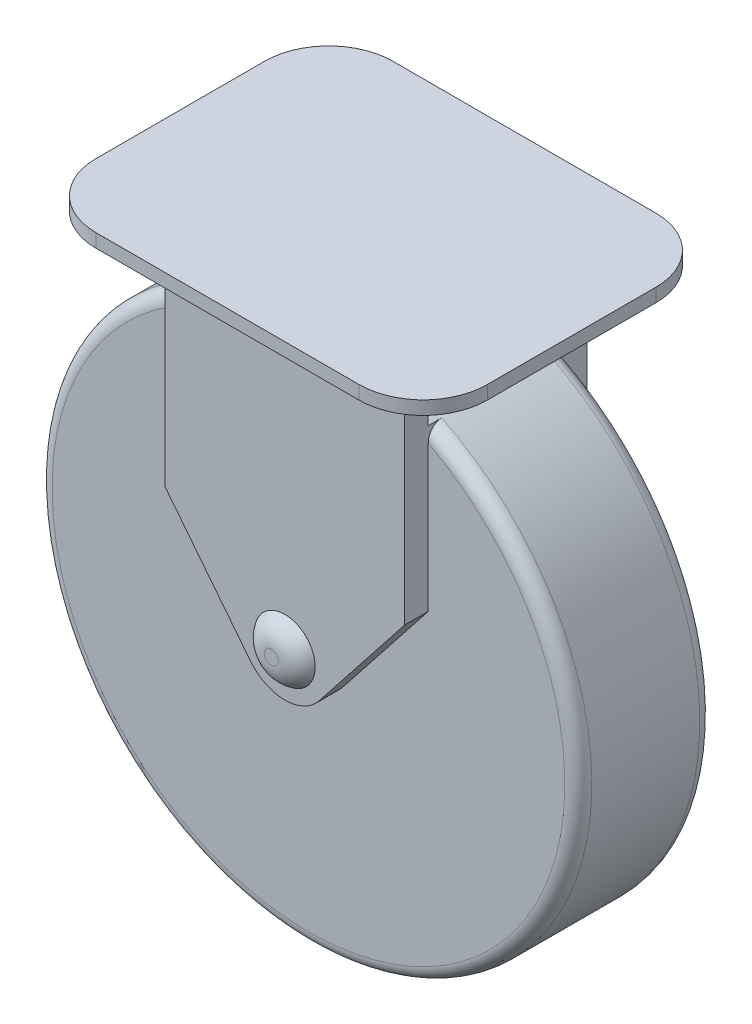
ISO-10303-21;
HEADER;
FILE_DESCRIPTION(('STEP AP214'),'2;1');
FILE_NAME('part.step','',(''),(''),'','','');
FILE_SCHEMA(('AUTOMOTIVE_DESIGN { 1 0 10303 214 1 1 1 1 }'));
ENDSEC;
DATA;
#1=APPLICATION_CONTEXT('core data for automotive mechanical design processes');
#2=APPLICATION_PROTOCOL_DEFINITION('international standard','automotive_design',2000,#1);
#3=PRODUCT_CONTEXT('',#1,'mechanical');
#4=PRODUCT('Part','Part','',(#3));
#5=PRODUCT_RELATED_PRODUCT_CATEGORY('part','',(#4));
#6=PRODUCT_DEFINITION_FORMATION('','',#4);
#7=PRODUCT_DEFINITION_CONTEXT('part definition',#1,'design');
#8=PRODUCT_DEFINITION('design','',#6,#7);
#9=PRODUCT_DEFINITION_SHAPE('','',#8);
#10=(LENGTH_UNIT() NAMED_UNIT(*) SI_UNIT(.MILLI.,.METRE.));
#11=(NAMED_UNIT(*) PLANE_ANGLE_UNIT() SI_UNIT($,.RADIAN.));
#12=(NAMED_UNIT(*) SI_UNIT($,.STERADIAN.) SOLID_ANGLE_UNIT());
#13=UNCERTAINTY_MEASURE_WITH_UNIT(LENGTH_MEASURE(1.E-05),#10,'distance_accuracy_value','');
#14=(GEOMETRIC_REPRESENTATION_CONTEXT(3) GLOBAL_UNCERTAINTY_ASSIGNED_CONTEXT((#13)) GLOBAL_UNIT_ASSIGNED_CONTEXT((#10,
#11,#12)) REPRESENTATION_CONTEXT('',''));
#15=CARTESIAN_POINT('',(0.,0.,0.));
#16=DIRECTION('',(0.,0.,1.));
#17=DIRECTION('',(1.,0.,0.));
#18=AXIS2_PLACEMENT_3D('',#15,#16,#17);
#19=CARTESIAN_POINT('',(0.,0.,21.43125));
#20=DIRECTION('',(0.,0.,-1.));
#21=DIRECTION('',(-1.,0.,0.));
#22=AXIS2_PLACEMENT_3D('',#19,#20,#21);
#23=CYLINDRICAL_SURFACE('',#22,10.31875);
#24=DIRECTION('',(0.,0.,-1.));
#25=VECTOR('',#24,1.);
#26=CARTESIAN_POINT('',(8.10028110584669,-6.39234288573157,21.43125));
#27=LINE('',#26,#25);
#28=CARTESIAN_POINT('',(8.10028110584669,-6.39234288573157,-15.875));
#29=VERTEX_POINT('',#28);
#30=CARTESIAN_POINT('',(8.10028110584669,-6.39234288573157,-21.43125));
#31=VERTEX_POINT('',#30);
#32=EDGE_CURVE('E385',#29,#31,#27,.T.);
#33=ORIENTED_EDGE('',*,*,#32,.F.);
#34=CARTESIAN_POINT('',(0.,0.,-15.875));
#35=DIRECTION('',(0.,0.,1.));
#36=DIRECTION('',(1.,0.,0.));
#37=AXIS2_PLACEMENT_3D('',#34,#35,#36);
#38=CIRCLE('',#37,10.31875);
#39=CARTESIAN_POINT('',(-8.1002811058467,-6.39234288573157,-15.875));
#40=VERTEX_POINT('',#39);
#41=EDGE_CURVE('E414',#29,#40,#38,.F.);
#42=ORIENTED_EDGE('',*,*,#41,.T.);
#43=DIRECTION('',(0.,0.,-1.));
#44=VECTOR('',#43,1.);
#45=CARTESIAN_POINT('',(-8.1002811058467,-6.39234288573157,21.43125));
#46=LINE('',#45,#44);
#47=CARTESIAN_POINT('',(-8.1002811058467,-6.39234288573157,-21.43125));
#48=VERTEX_POINT('',#47);
#49=EDGE_CURVE('E342',#40,#48,#46,.T.);
#50=ORIENTED_EDGE('',*,*,#49,.T.);
#51=CARTESIAN_POINT('',(0.,0.,-21.43125));
#52=DIRECTION('',(0.,0.,1.));
#53=DIRECTION('',(1.,0.,0.));
#54=AXIS2_PLACEMENT_3D('',#51,#52,#53);
#55=CIRCLE('',#54,10.31875);
#56=EDGE_CURVE('E317',#48,#31,#55,.T.);
#57=ORIENTED_EDGE('',*,*,#56,.T.);
#58=EDGE_LOOP('',(#33,#42,#50,#57));
#59=FACE_BOUND('',#58,.T.);
#60=ADVANCED_FACE('F51',(#59),#23,.T.);
#61=CARTESIAN_POINT('',(8.10028110584669,-6.39234288573157,21.43125));
#62=DIRECTION('',(0.785006042965155,-0.619488105219292,0.));
#63=DIRECTION('',(0.619488105219292,0.785006042965155,0.));
#64=AXIS2_PLACEMENT_3D('',#61,#62,#63);
#65=PLANE('',#64);
#66=DIRECTION('',(0.619488105219292,0.785006042965155,0.));
#67=VECTOR('',#66,1.);
#68=CARTESIAN_POINT('',(8.10028110584669,-6.39234288573157,-15.875));
#69=LINE('',#68,#67);
#70=CARTESIAN_POINT('',(28.178125,19.05,-15.875));
#71=VERTEX_POINT('',#70);
#72=EDGE_CURVE('E418',#29,#71,#69,.T.);
#73=ORIENTED_EDGE('',*,*,#72,.F.);
#74=ORIENTED_EDGE('',*,*,#32,.T.);
#75=DIRECTION('',(-0.619488105219292,-0.785006042965155,0.));
#76=VECTOR('',#75,1.);
#77=CARTESIAN_POINT('',(8.10028110584669,-6.39234288573157,-21.43125));
#78=LINE('',#77,#76);
#79=CARTESIAN_POINT('',(28.178125,19.05,-21.43125));
#80=VERTEX_POINT('',#79);
#81=EDGE_CURVE('E346',#80,#31,#78,.T.);
#82=ORIENTED_EDGE('',*,*,#81,.F.);
#83=DIRECTION('',(0.,0.,-1.));
#84=VECTOR('',#83,1.);
#85=CARTESIAN_POINT('',(28.178125,19.05,21.43125));
#86=LINE('',#85,#84);
#87=EDGE_CURVE('E380',#71,#80,#86,.T.);
#88=ORIENTED_EDGE('',*,*,#87,.F.);
#89=EDGE_LOOP('',(#73,#74,#82,#88));
#90=FACE_BOUND('',#89,.T.);
#91=ADVANCED_FACE('F522',(#90),#65,.T.);
#92=CARTESIAN_POINT('',(-8.1002811058467,-6.39234288573157,21.43125));
#93=DIRECTION('',(-0.785006042965155,-0.619488105219292,0.));
#94=DIRECTION('',(0.619488105219292,-0.785006042965155,0.));
#95=AXIS2_PLACEMENT_3D('',#92,#93,#94);
#96=PLANE('',#95);
#97=DIRECTION('',(0.619488105219292,-0.785006042965155,0.));
#98=VECTOR('',#97,1.);
#99=CARTESIAN_POINT('',(-8.1002811058467,-6.39234288573157,-15.875));
#100=LINE('',#99,#98);
#101=CARTESIAN_POINT('',(-28.178125,19.05,-15.875));
#102=VERTEX_POINT('',#101);
#103=EDGE_CURVE('E407',#102,#40,#100,.T.);
#104=ORIENTED_EDGE('',*,*,#103,.F.);
#105=DIRECTION('',(0.,0.,-1.));
#106=VECTOR('',#105,1.);
#107=CARTESIAN_POINT('',(-28.178125,19.05,21.43125));
#108=LINE('',#107,#106);
#109=CARTESIAN_POINT('',(-28.178125,19.05,-21.43125));
#110=VERTEX_POINT('',#109);
#111=EDGE_CURVE('E368',#102,#110,#108,.T.);
#112=ORIENTED_EDGE('',*,*,#111,.T.);
#113=DIRECTION('',(-0.619488105219292,0.785006042965155,0.));
#114=VECTOR('',#113,1.);
#115=CARTESIAN_POINT('',(-8.1002811058467,-6.39234288573157,-21.43125));
#116=LINE('',#115,#114);
#117=EDGE_CURVE('E322',#48,#110,#116,.T.);
#118=ORIENTED_EDGE('',*,*,#117,.F.);
#119=ORIENTED_EDGE('',*,*,#49,.F.);
#120=EDGE_LOOP('',(#104,#112,#118,#119));
#121=FACE_BOUND('',#120,.T.);
#122=ADVANCED_FACE('F528',(#121),#96,.T.);
#123=CARTESIAN_POINT('',(0.,0.,15.875));
#124=DIRECTION('',(0.,0.,1.));
#125=DIRECTION('',(1.,0.,0.));
#126=AXIS2_PLACEMENT_3D('',#123,#124,#125);
#127=CIRCLE('',#126,10.31875);
#128=CARTESIAN_POINT('',(8.10028110584669,-6.39234288573157,15.875));
#129=VERTEX_POINT('',#128);
#130=CARTESIAN_POINT('',(-8.1002811058467,-6.39234288573157,15.875));
#131=VERTEX_POINT('',#130);
#132=EDGE_CURVE('E403',#129,#131,#127,.F.);
#133=ORIENTED_EDGE('',*,*,#132,.F.);
#134=CARTESIAN_POINT('',(8.10028110584669,-6.39234288573157,21.43125));
#135=VERTEX_POINT('',#134);
#136=EDGE_CURVE('E386',#135,#129,#27,.T.);
#137=ORIENTED_EDGE('',*,*,#136,.F.);
#138=CARTESIAN_POINT('',(0.,0.,21.43125));
#139=DIRECTION('',(0.,0.,1.));
#140=DIRECTION('',(1.,0.,0.));
#141=AXIS2_PLACEMENT_3D('',#138,#139,#140);
#142=CIRCLE('',#141,10.31875);
#143=CARTESIAN_POINT('',(-8.1002811058467,-6.39234288573157,21.43125));
#144=VERTEX_POINT('',#143);
#145=EDGE_CURVE('E318',#144,#135,#142,.T.);
#146=ORIENTED_EDGE('',*,*,#145,.F.);
#147=EDGE_CURVE('E364',#144,#131,#46,.T.);
#148=ORIENTED_EDGE('',*,*,#147,.T.);
#149=EDGE_LOOP('',(#133,#137,#146,#148));
#150=FACE_BOUND('',#149,.T.);
#151=ADVANCED_FACE('F524',(#150),#23,.T.);
#152=ORIENTED_EDGE('',*,*,#136,.T.);
#153=DIRECTION('',(0.619488105219292,0.785006042965155,0.));
#154=VECTOR('',#153,1.);
#155=CARTESIAN_POINT('',(8.10028110584669,-6.39234288573157,15.875));
#156=LINE('',#155,#154);
#157=CARTESIAN_POINT('',(28.178125,19.05,15.875));
#158=VERTEX_POINT('',#157);
#159=EDGE_CURVE('E400',#129,#158,#156,.T.);
#160=ORIENTED_EDGE('',*,*,#159,.T.);
#161=CARTESIAN_POINT('',(28.178125,19.05,21.43125));
#162=VERTEX_POINT('',#161);
#163=EDGE_CURVE('E381',#162,#158,#86,.T.);
#164=ORIENTED_EDGE('',*,*,#163,.F.);
#165=DIRECTION('',(-0.619488105219292,-0.785006042965155,0.));
#166=VECTOR('',#165,1.);
#167=CARTESIAN_POINT('',(8.10028110584669,-6.39234288573157,21.43125));
#168=LINE('',#167,#166);
#169=EDGE_CURVE('E321',#162,#135,#168,.T.);
#170=ORIENTED_EDGE('',*,*,#169,.T.);
#171=EDGE_LOOP('',(#152,#160,#164,#170));
#172=FACE_BOUND('',#171,.T.);
#173=ADVANCED_FACE('F481',(#172),#65,.T.);
#174=CARTESIAN_POINT('',(28.178125,0.,21.43125));
#175=DIRECTION('',(1.,0.,0.));
#176=DIRECTION('',(0.,0.,-1.));
#177=AXIS2_PLACEMENT_3D('',#174,#175,#176);
#178=PLANE('',#177);
#179=DIRECTION('',(0.,1.,0.));
#180=VECTOR('',#179,1.);
#181=CARTESIAN_POINT('',(28.178125,0.,-15.875));
#182=LINE('',#181,#180);
#183=CARTESIAN_POINT('',(28.178125,56.9055645036966,-15.875));
#184=VERTEX_POINT('',#183);
#185=CARTESIAN_POINT('',(28.178125,66.675,-15.875));
#186=VERTEX_POINT('',#185);
#187=EDGE_CURVE('E274',#184,#186,#182,.T.);
#188=ORIENTED_EDGE('',*,*,#187,.F.);
#189=DIRECTION('',(0.,0.,-1.));
#190=VECTOR('',#189,1.);
#191=CARTESIAN_POINT('',(28.178125,56.9055645036966,-12.7));
#192=LINE('',#191,#190);
#193=CARTESIAN_POINT('',(28.178125,56.9055645036966,-12.7));
#194=VERTEX_POINT('',#193);
#195=EDGE_CURVE('E447',#194,#184,#192,.T.);
#196=ORIENTED_EDGE('',*,*,#195,.F.);
#197=CARTESIAN_POINT('',(28.178125,56.9055645036966,-12.7));
#198=CARTESIAN_POINT('',(28.178125,56.9055784410819,-12.7825452910411));
#199=CARTESIAN_POINT('',(28.178125,56.9019726960796,-12.8650837659532));
#200=CARTESIAN_POINT('',(28.178125,56.8876287220627,-13.0295183018202));
#201=CARTESIAN_POINT('',(28.178125,56.8768922987349,-13.1114145201016));
#202=CARTESIAN_POINT('',(28.178125,56.8484423853257,-13.2737007313163));
#203=CARTESIAN_POINT('',(28.178125,56.8307528347604,-13.3540949112545));
#204=CARTESIAN_POINT('',(28.178125,56.7886146894372,-13.5130706926774));
#205=CARTESIAN_POINT('',(28.178125,56.7641659095749,-13.5916522444586));
#206=CARTESIAN_POINT('',(28.178125,56.6810754442341,-13.8237798323662));
#207=CARTESIAN_POINT('',(28.178125,56.6126481364356,-13.9739412327145));
#208=CARTESIAN_POINT('',(28.178125,56.4525116211937,-14.2612199352461));
#209=CARTESIAN_POINT('',(28.178125,56.3607885184095,-14.3983293849365));
#210=CARTESIAN_POINT('',(28.178125,56.1532674083132,-14.6619170637052));
#211=CARTESIAN_POINT('',(28.178125,56.0366552297094,-14.7877533337012));
#212=CARTESIAN_POINT('',(28.178125,55.7856826392004,-15.0201711161666));
#213=CARTESIAN_POINT('',(28.178125,55.6513187315286,-15.1267488263229));
#214=CARTESIAN_POINT('',(28.178125,55.3546962287607,-15.3287988512625));
#215=CARTESIAN_POINT('',(28.178125,55.1909939256116,-15.4221495715723));
#216=CARTESIAN_POINT('',(28.178125,54.8512948745381,-15.5831209708427));
#217=CARTESIAN_POINT('',(28.178125,54.6752864659418,-15.6507168437418));
#218=CARTESIAN_POINT('',(28.178125,54.3081148771441,-15.7618882266433));
#219=CARTESIAN_POINT('',(28.178125,54.1166267914801,-15.8043852723537));
#220=CARTESIAN_POINT('',(28.178125,53.7298750876661,-15.8609320963934));
#221=CARTESIAN_POINT('',(28.178125,53.5346198514007,-15.8750390029093));
#222=CARTESIAN_POINT('',(28.178125,53.3394684683338,-15.875));
#223=B_SPLINE_CURVE_WITH_KNOTS('',3,(#197,#198,#199,#200,#201,#202,#203,#204,#205,#206,#207,
#208,#209,#210,#211,#212,#213,#214,#215,#216,#217,#218,#219,#220,#221,#222),.UNSPECIFIED.,.F.,
.F.,(4,2,2,2,2,2,2,2,2,2,2,2,4),(0.,0.247545607339586,0.49502855311398,0.741666779109121,
0.988311760066779,1.48090239250049,1.97378753542249,2.48632722746523,2.99896800246119,
3.56200273153854,4.12557839096832,4.71187880713827,5.29699825323377),.UNSPECIFIED.);
#224=CARTESIAN_POINT('',(28.178125,53.3394684683338,-15.875));
#225=VERTEX_POINT('',#224);
#226=EDGE_CURVE('E457',#194,#225,#223,.T.);
#227=ORIENTED_EDGE('',*,*,#226,.T.);
#228=DIRECTION('',(0.,1.,0.));
#229=VECTOR('',#228,1.);
#230=CARTESIAN_POINT('',(28.178125,0.,-15.875));
#231=LINE('',#230,#229);
#232=EDGE_CURVE('E286',#71,#225,#231,.T.);
#233=ORIENTED_EDGE('',*,*,#232,.F.);
#234=ORIENTED_EDGE('',*,*,#87,.T.);
#235=DIRECTION('',(0.,-1.,0.));
#236=VECTOR('',#235,1.);
#237=CARTESIAN_POINT('',(28.178125,0.,-21.43125));
#238=LINE('',#237,#236);
#239=CARTESIAN_POINT('',(28.178125,73.025,-21.43125));
#240=VERTEX_POINT('',#239);
#241=EDGE_CURVE('E350',#240,#80,#238,.T.);
#242=ORIENTED_EDGE('',*,*,#241,.F.);
#243=DIRECTION('',(0.,0.,-1.));
#244=VECTOR('',#243,1.);
#245=CARTESIAN_POINT('',(28.178125,73.025,21.43125));
#246=LINE('',#245,#244);
#247=CARTESIAN_POINT('',(28.178125,73.025,21.43125));
#248=VERTEX_POINT('',#247);
#249=EDGE_CURVE('E376',#248,#240,#246,.T.);
#250=ORIENTED_EDGE('',*,*,#249,.F.);
#251=DIRECTION('',(0.,-1.,0.));
#252=VECTOR('',#251,1.);
#253=CARTESIAN_POINT('',(28.178125,0.,21.43125));
#254=LINE('',#253,#252);
#255=EDGE_CURVE('E326',#248,#162,#254,.T.);
#256=ORIENTED_EDGE('',*,*,#255,.T.);
#257=ORIENTED_EDGE('',*,*,#163,.T.);
#258=DIRECTION('',(0.,1.,0.));
#259=VECTOR('',#258,1.);
#260=CARTESIAN_POINT('',(28.178125,0.,15.875));
#261=LINE('',#260,#259);
#262=CARTESIAN_POINT('',(28.178125,53.3394684683338,15.875));
#263=VERTEX_POINT('',#262);
#264=EDGE_CURVE('E396',#158,#263,#261,.T.);
#265=ORIENTED_EDGE('',*,*,#264,.T.);
#266=CARTESIAN_POINT('',(28.178125,53.3394684683338,15.875));
#267=CARTESIAN_POINT('',(28.178125,53.4499569892648,15.8749946230494));
#268=CARTESIAN_POINT('',(28.178125,53.5604027488315,15.8704896075508));
#269=CARTESIAN_POINT('',(28.178125,53.7805815345682,15.8524341122105));
#270=CARTESIAN_POINT('',(28.178125,53.8903143571871,15.8388811545989));
#271=CARTESIAN_POINT('',(28.178125,54.2180410124744,15.7844801601789));
#272=CARTESIAN_POINT('',(28.178125,54.4339168235813,15.7298893612635));
#273=CARTESIAN_POINT('',(28.178125,54.8535930769766,15.584047526342));
#274=CARTESIAN_POINT('',(28.178125,55.0573666307146,15.4927181231356));
#275=CARTESIAN_POINT('',(28.178125,55.3477296266557,15.3292131773186));
#276=CARTESIAN_POINT('',(28.178125,55.4419591448965,15.2703002156053));
#277=CARTESIAN_POINT('',(28.178125,55.6244213856614,15.1438551909129));
#278=CARTESIAN_POINT('',(28.178125,55.7126574375875,15.0763279742064));
#279=CARTESIAN_POINT('',(28.178125,55.8756781738629,14.9384414522539));
#280=CARTESIAN_POINT('',(28.178125,55.9509755103084,14.8686872920248));
#281=CARTESIAN_POINT('',(28.178125,56.0947300434389,14.7225121032731));
#282=CARTESIAN_POINT('',(28.178125,56.1631909789899,14.646094762196));
#283=CARTESIAN_POINT('',(28.178125,56.2924943001695,14.4870318768936));
#284=CARTESIAN_POINT('',(28.178125,56.3533351972729,14.4043851208275));
#285=CARTESIAN_POINT('',(28.178125,56.4665636800856,14.2334938988475));
#286=CARTESIAN_POINT('',(28.178125,56.5189526961119,14.1452503836054));
#287=CARTESIAN_POINT('',(28.178125,56.6089965529094,13.9743965141672));
#288=CARTESIAN_POINT('',(28.178125,56.6476544607948,13.8923135759775));
#289=CARTESIAN_POINT('',(28.178125,56.7172955631954,13.7249586348485));
#290=CARTESIAN_POINT('',(28.178125,56.7482798924925,13.6396871055927));
#291=CARTESIAN_POINT('',(28.178125,56.8021243363856,13.466800699863));
#292=CARTESIAN_POINT('',(28.178125,56.825000305078,13.3791907605498));
#293=CARTESIAN_POINT('',(28.178125,56.86239415031,13.2022461774297));
#294=CARTESIAN_POINT('',(28.178125,56.8769171780315,13.1129126317663));
#295=CARTESIAN_POINT('',(28.178125,56.8932965824253,12.969447977044));
#296=CARTESIAN_POINT('',(28.178125,56.8978983522866,12.9156162514886));
#297=CARTESIAN_POINT('',(28.178125,56.904030765547,12.8078589113691));
#298=CARTESIAN_POINT('',(28.178125,56.9055659863956,12.7539335571844));
#299=CARTESIAN_POINT('',(28.178125,56.9055645036966,12.7));
#300=B_SPLINE_CURVE_WITH_KNOTS('',3,(#266,#267,#268,#269,#270,#271,#272,#273,#274,#275,#276,
#277,#278,#279,#280,#281,#282,#283,#284,#285,#286,#287,#288,#289,#290,#291,#292,#293,#294,#295,
#296,#297,#298,#299),.UNSPECIFIED.,.F.,.F.,(4,2,2,2,2,2,2,2,2,2,2,2,2,2,2,2,4),(0.,
0.331285281788094,0.662661322955742,1.32732811122519,1.99342028432537,2.32640029747418,
2.65919379960684,2.9666983225028,3.27403373763953,3.58142909542974,3.88877237781614,
4.16059969157094,4.43238678300128,4.70363948498036,4.97472472805095,5.13672939398726,
5.29849205368416),.UNSPECIFIED.);
#301=CARTESIAN_POINT('',(28.178125,56.9055645036966,12.7));
#302=VERTEX_POINT('',#301);
#303=EDGE_CURVE('E487',#263,#302,#300,.T.);
#304=ORIENTED_EDGE('',*,*,#303,.T.);
#305=DIRECTION('',(0.,0.,-1.));
#306=VECTOR('',#305,1.);
#307=CARTESIAN_POINT('',(28.178125,56.9055645036966,15.875));
#308=LINE('',#307,#306);
#309=CARTESIAN_POINT('',(28.178125,56.9055645036966,15.875));
#310=VERTEX_POINT('',#309);
#311=EDGE_CURVE('E436',#310,#302,#308,.T.);
#312=ORIENTED_EDGE('',*,*,#311,.F.);
#313=DIRECTION('',(0.,-1.,0.));
#314=VECTOR('',#313,1.);
#315=CARTESIAN_POINT('',(28.178125,0.,15.875));
#316=LINE('',#315,#314);
#317=CARTESIAN_POINT('',(28.178125,66.675,15.875));
#318=VERTEX_POINT('',#317);
#319=EDGE_CURVE('E249',#318,#310,#316,.T.);
#320=ORIENTED_EDGE('',*,*,#319,.F.);
#321=DIRECTION('',(0.,0.,1.));
#322=VECTOR('',#321,1.);
#323=CARTESIAN_POINT('',(28.178125,66.675,21.43125));
#324=LINE('',#323,#322);
#325=EDGE_CURVE('E277',#186,#318,#324,.T.);
#326=ORIENTED_EDGE('',*,*,#325,.F.);
#327=EDGE_LOOP('',(#188,#196,#227,#233,#234,#242,#250,#256,#257,#265,#304,#312,#320,#326));
#328=FACE_BOUND('',#327,.T.);
#329=ADVANCED_FACE('F477',(#328),#178,.T.);
#330=CARTESIAN_POINT('',(-28.178125,0.,21.43125));
#331=DIRECTION('',(-1.,0.,0.));
#332=DIRECTION('',(0.,0.,1.));
#333=AXIS2_PLACEMENT_3D('',#330,#331,#332);
#334=PLANE('',#333);
#335=DIRECTION('',(0.,-1.,0.));
#336=VECTOR('',#335,1.);
#337=CARTESIAN_POINT('',(-28.178125,66.675,-15.875));
#338=LINE('',#337,#336);
#339=CARTESIAN_POINT('',(-28.178125,66.675,-15.875));
#340=VERTEX_POINT('',#339);
#341=CARTESIAN_POINT('',(-28.178125,56.9055645036966,-15.875));
#342=VERTEX_POINT('',#341);
#343=EDGE_CURVE('E259',#340,#342,#338,.T.);
#344=ORIENTED_EDGE('',*,*,#343,.F.);
#345=DIRECTION('',(0.,0.,-1.));
#346=VECTOR('',#345,1.);
#347=CARTESIAN_POINT('',(-28.178125,66.675,-15.875));
#348=LINE('',#347,#346);
#349=CARTESIAN_POINT('',(-28.178125,66.675,15.875));
#350=VERTEX_POINT('',#349);
#351=EDGE_CURVE('E257',#350,#340,#348,.T.);
#352=ORIENTED_EDGE('',*,*,#351,.F.);
#353=DIRECTION('',(0.,1.,0.));
#354=VECTOR('',#353,1.);
#355=CARTESIAN_POINT('',(-28.178125,66.675,15.875));
#356=LINE('',#355,#354);
#357=CARTESIAN_POINT('',(-28.178125,56.9055645036966,15.875));
#358=VERTEX_POINT('',#357);
#359=EDGE_CURVE('E246',#358,#350,#356,.T.);
#360=ORIENTED_EDGE('',*,*,#359,.F.);
#361=DIRECTION('',(0.,0.,-1.));
#362=VECTOR('',#361,1.);
#363=CARTESIAN_POINT('',(-28.178125,56.9055645036966,12.7));
#364=LINE('',#363,#362);
#365=CARTESIAN_POINT('',(-28.178125,56.9055645036966,12.7));
#366=VERTEX_POINT('',#365);
#367=EDGE_CURVE('E227',#366,#358,#364,.F.);
#368=ORIENTED_EDGE('',*,*,#367,.F.);
#369=CARTESIAN_POINT('',(-28.178125,56.9055645036966,12.7));
#370=CARTESIAN_POINT('',(-28.178125,56.9055784410819,12.7825452910411));
#371=CARTESIAN_POINT('',(-28.178125,56.9019726960796,12.8650837659532));
#372=CARTESIAN_POINT('',(-28.178125,56.8876287220627,13.0295183018202));
#373=CARTESIAN_POINT('',(-28.178125,56.8768922987349,13.1114145201016));
#374=CARTESIAN_POINT('',(-28.178125,56.8484423853257,13.2737007313163));
#375=CARTESIAN_POINT('',(-28.178125,56.8307528347604,13.3540949112545));
#376=CARTESIAN_POINT('',(-28.178125,56.7886146894372,13.5130706926774));
#377=CARTESIAN_POINT('',(-28.178125,56.764165909575,13.5916522444586));
#378=CARTESIAN_POINT('',(-28.178125,56.6810754442342,13.8237798323662));
#379=CARTESIAN_POINT('',(-28.178125,56.6126481364356,13.9739412327145));
#380=CARTESIAN_POINT('',(-28.178125,56.4525116211937,14.2612199352461));
#381=CARTESIAN_POINT('',(-28.178125,56.3607885184095,14.3983293849365));
#382=CARTESIAN_POINT('',(-28.178125,56.1532674083132,14.6619170637052));
#383=CARTESIAN_POINT('',(-28.178125,56.0366552297094,14.7877533337012));
#384=CARTESIAN_POINT('',(-28.178125,55.7856826392004,15.0201711161666));
#385=CARTESIAN_POINT('',(-28.178125,55.6513187315286,15.1267488263229));
#386=CARTESIAN_POINT('',(-28.178125,55.3546962287607,15.3287988512625));
#387=CARTESIAN_POINT('',(-28.178125,55.1909939256116,15.4221495715723));
#388=CARTESIAN_POINT('',(-28.178125,54.8512948745381,15.5831209708427));
#389=CARTESIAN_POINT('',(-28.178125,54.6752864659418,15.6507168437418));
#390=CARTESIAN_POINT('',(-28.178125,54.3081148771441,15.7618882266433));
#391=CARTESIAN_POINT('',(-28.178125,54.1166267914801,15.8043852723537));
#392=CARTESIAN_POINT('',(-28.178125,53.7298750876661,15.8609320963934));
#393=CARTESIAN_POINT('',(-28.178125,53.5346198514007,15.8750390029093));
#394=CARTESIAN_POINT('',(-28.178125,53.3394684683338,15.875));
#395=B_SPLINE_CURVE_WITH_KNOTS('',3,(#369,#370,#371,#372,#373,#374,#375,#376,#377,#378,#379,
#380,#381,#382,#383,#384,#385,#386,#387,#388,#389,#390,#391,#392,#393,#394),.UNSPECIFIED.,.F.,
.F.,(4,2,2,2,2,2,2,2,2,2,2,2,4),(0.,0.247545607339587,0.495028553113982,0.741666779109124,
0.988311760066777,1.48090239250049,1.97378753542249,2.48632722746523,2.99896800246119,
3.56200273153853,4.12557839096831,4.71187880713826,5.29699825323377),.UNSPECIFIED.);
#396=CARTESIAN_POINT('',(-28.178125,53.3394684683338,15.875));
#397=VERTEX_POINT('',#396);
#398=EDGE_CURVE('E494',#366,#397,#395,.T.);
#399=ORIENTED_EDGE('',*,*,#398,.T.);
#400=DIRECTION('',(0.,-1.,0.));
#401=VECTOR('',#400,1.);
#402=CARTESIAN_POINT('',(-28.178125,0.,15.875));
#403=LINE('',#402,#401);
#404=CARTESIAN_POINT('',(-28.178125,19.05,15.875));
#405=VERTEX_POINT('',#404);
#406=EDGE_CURVE('E393',#397,#405,#403,.T.);
#407=ORIENTED_EDGE('',*,*,#406,.T.);
#408=CARTESIAN_POINT('',(-28.178125,19.05,21.43125));
#409=VERTEX_POINT('',#408);
#410=EDGE_CURVE('E369',#409,#405,#108,.T.);
#411=ORIENTED_EDGE('',*,*,#410,.F.);
#412=DIRECTION('',(0.,1.,0.));
#413=VECTOR('',#412,1.);
#414=CARTESIAN_POINT('',(-28.178125,0.,21.43125));
#415=LINE('',#414,#413);
#416=CARTESIAN_POINT('',(-28.178125,73.025,21.43125));
#417=VERTEX_POINT('',#416);
#418=EDGE_CURVE('E334',#409,#417,#415,.T.);
#419=ORIENTED_EDGE('',*,*,#418,.T.);
#420=DIRECTION('',(0.,0.,-1.));
#421=VECTOR('',#420,1.);
#422=CARTESIAN_POINT('',(-28.178125,73.025,21.43125));
#423=LINE('',#422,#421);
#424=CARTESIAN_POINT('',(-28.178125,73.025,-21.43125));
#425=VERTEX_POINT('',#424);
#426=EDGE_CURVE('E373',#417,#425,#423,.T.);
#427=ORIENTED_EDGE('',*,*,#426,.T.);
#428=DIRECTION('',(0.,1.,0.));
#429=VECTOR('',#428,1.);
#430=CARTESIAN_POINT('',(-28.178125,0.,-21.43125));
#431=LINE('',#430,#429);
#432=EDGE_CURVE('E357',#110,#425,#431,.T.);
#433=ORIENTED_EDGE('',*,*,#432,.F.);
#434=ORIENTED_EDGE('',*,*,#111,.F.);
#435=DIRECTION('',(0.,-1.,0.));
#436=VECTOR('',#435,1.);
#437=CARTESIAN_POINT('',(-28.178125,0.,-15.875));
#438=LINE('',#437,#436);
#439=CARTESIAN_POINT('',(-28.178125,53.3394684683338,-15.875));
#440=VERTEX_POINT('',#439);
#441=EDGE_CURVE('E411',#440,#102,#438,.T.);
#442=ORIENTED_EDGE('',*,*,#441,.F.);
#443=CARTESIAN_POINT('',(-28.178125,53.3394684683338,-15.875));
#444=CARTESIAN_POINT('',(-28.178125,53.4499569892648,-15.8749946230494));
#445=CARTESIAN_POINT('',(-28.178125,53.5604027488315,-15.8704896075508));
#446=CARTESIAN_POINT('',(-28.178125,53.7805815345682,-15.8524341122105));
#447=CARTESIAN_POINT('',(-28.178125,53.8903143571871,-15.8388811545989));
#448=CARTESIAN_POINT('',(-28.178125,54.2180410124744,-15.7844801601789));
#449=CARTESIAN_POINT('',(-28.178125,54.4339168235813,-15.7298893612635));
#450=CARTESIAN_POINT('',(-28.178125,54.8535930769766,-15.584047526342));
#451=CARTESIAN_POINT('',(-28.178125,55.0573666307146,-15.4927181231356));
#452=CARTESIAN_POINT('',(-28.178125,55.3477296266557,-15.3292131773186));
#453=CARTESIAN_POINT('',(-28.178125,55.4419591448965,-15.2703002156053));
#454=CARTESIAN_POINT('',(-28.178125,55.6244213856614,-15.1438551909129));
#455=CARTESIAN_POINT('',(-28.178125,55.7126574375875,-15.0763279742064));
#456=CARTESIAN_POINT('',(-28.178125,55.8756781738629,-14.9384414522539));
#457=CARTESIAN_POINT('',(-28.178125,55.9509755103084,-14.8686872920248));
#458=CARTESIAN_POINT('',(-28.178125,56.0947300434389,-14.7225121032731));
#459=CARTESIAN_POINT('',(-28.178125,56.1631909789899,-14.646094762196));
#460=CARTESIAN_POINT('',(-28.178125,56.2924943001695,-14.4870318768936));
#461=CARTESIAN_POINT('',(-28.178125,56.3533351972729,-14.4043851208275));
#462=CARTESIAN_POINT('',(-28.178125,56.4665636800856,-14.2334938988475));
#463=CARTESIAN_POINT('',(-28.178125,56.5189526961119,-14.1452503836054));
#464=CARTESIAN_POINT('',(-28.178125,56.6089965529094,-13.9743965141672));
#465=CARTESIAN_POINT('',(-28.178125,56.6476544607948,-13.8923135759775));
#466=CARTESIAN_POINT('',(-28.178125,56.7172955631954,-13.7249586348485));
#467=CARTESIAN_POINT('',(-28.178125,56.7482798924925,-13.6396871055927));
#468=CARTESIAN_POINT('',(-28.178125,56.8021243363856,-13.466800699863));
#469=CARTESIAN_POINT('',(-28.178125,56.825000305078,-13.3791907605498));
#470=CARTESIAN_POINT('',(-28.178125,56.86239415031,-13.2022461774297));
#471=CARTESIAN_POINT('',(-28.178125,56.8769171780315,-13.1129126317663));
#472=CARTESIAN_POINT('',(-28.178125,56.8932965824253,-12.969447977044));
#473=CARTESIAN_POINT('',(-28.178125,56.8978983522866,-12.9156162514886));
#474=CARTESIAN_POINT('',(-28.178125,56.904030765547,-12.8078589113691));
#475=CARTESIAN_POINT('',(-28.178125,56.9055659863956,-12.7539335571844));
#476=CARTESIAN_POINT('',(-28.178125,56.9055645036966,-12.7));
#477=B_SPLINE_CURVE_WITH_KNOTS('',3,(#443,#444,#445,#446,#447,#448,#449,#450,#451,#452,#453,
#454,#455,#456,#457,#458,#459,#460,#461,#462,#463,#464,#465,#466,#467,#468,#469,#470,#471,#472,
#473,#474,#475,#476),.UNSPECIFIED.,.F.,.F.,(4,2,2,2,2,2,2,2,2,2,2,2,2,2,2,2,4),(0.,
0.331285281788094,0.662661322955742,1.32732811122519,1.99342028432537,2.32640029747418,
2.65919379960684,2.9666983225028,3.27403373763953,3.58142909542974,3.88877237781614,
4.16059969157094,4.43238678300128,4.70363948498036,4.97472472805095,5.13672939398726,
5.29849205368416),.UNSPECIFIED.);
#478=CARTESIAN_POINT('',(-28.178125,56.9055645036966,-12.7));
#479=VERTEX_POINT('',#478);
#480=EDGE_CURVE('E466',#440,#479,#477,.T.);
#481=ORIENTED_EDGE('',*,*,#480,.T.);
#482=DIRECTION('',(0.,0.,-1.));
#483=VECTOR('',#482,1.);
#484=CARTESIAN_POINT('',(-28.178125,56.9055645036966,-15.875));
#485=LINE('',#484,#483);
#486=EDGE_CURVE('E439',#342,#479,#485,.F.);
#487=ORIENTED_EDGE('',*,*,#486,.F.);
#488=EDGE_LOOP('',(#344,#352,#360,#368,#399,#407,#411,#419,#427,#433,#434,#442,#481,#487));
#489=FACE_BOUND('',#488,.T.);
#490=ADVANCED_FACE('F255',(#489),#334,.T.);
#491=ORIENTED_EDGE('',*,*,#410,.T.);
#492=DIRECTION('',(0.619488105219292,-0.785006042965155,0.));
#493=VECTOR('',#492,1.);
#494=CARTESIAN_POINT('',(-8.1002811058467,-6.39234288573157,15.875));
#495=LINE('',#494,#493);
#496=EDGE_CURVE('E390',#405,#131,#495,.T.);
#497=ORIENTED_EDGE('',*,*,#496,.T.);
#498=ORIENTED_EDGE('',*,*,#147,.F.);
#499=DIRECTION('',(-0.619488105219292,0.785006042965155,0.));
#500=VECTOR('',#499,1.);
#501=CARTESIAN_POINT('',(-8.1002811058467,-6.39234288573157,21.43125));
#502=LINE('',#501,#500);
#503=EDGE_CURVE('E338',#144,#409,#502,.T.);
#504=ORIENTED_EDGE('',*,*,#503,.T.);
#505=EDGE_LOOP('',(#491,#497,#498,#504));
#506=FACE_BOUND('',#505,.T.);
#507=ADVANCED_FACE('F540',(#506),#96,.T.);
#508=CARTESIAN_POINT('',(0.,0.,21.43125));
#509=DIRECTION('',(0.,0.,1.));
#510=DIRECTION('',(1.,0.,0.));
#511=AXIS2_PLACEMENT_3D('',#508,#509,#510);
#512=PLANE('',#511);
#513=CARTESIAN_POINT('',(0.,0.,21.43125));
#514=DIRECTION('',(0.,0.,1.));
#515=DIRECTION('',(1.,0.,0.));
#516=AXIS2_PLACEMENT_3D('',#513,#514,#515);
#517=CIRCLE('',#516,7.14375);
#518=CARTESIAN_POINT('',(7.14375,0.,21.43125));
#519=VERTEX_POINT('',#518);
#520=EDGE_CURVE('E281',#519,#519,#517,.T.);
#521=ORIENTED_EDGE('',*,*,#520,.F.);
#522=EDGE_LOOP('',(#521));
#523=FACE_BOUND('',#522,.T.);
#524=ORIENTED_EDGE('',*,*,#145,.T.);
#525=ORIENTED_EDGE('',*,*,#169,.F.);
#526=ORIENTED_EDGE('',*,*,#255,.F.);
#527=DIRECTION('',(1.,0.,0.));
#528=VECTOR('',#527,1.);
#529=CARTESIAN_POINT('',(0.,73.025,21.43125));
#530=LINE('',#529,#528);
#531=EDGE_CURVE('E330',#417,#248,#530,.T.);
#532=ORIENTED_EDGE('',*,*,#531,.F.);
#533=ORIENTED_EDGE('',*,*,#418,.F.);
#534=ORIENTED_EDGE('',*,*,#503,.F.);
#535=EDGE_LOOP('',(#524,#525,#526,#532,#533,#534));
#536=FACE_BOUND('',#535,.T.);
#537=ADVANCED_FACE('F554',(#523,#536),#512,.T.);
#538=CARTESIAN_POINT('',(0.,0.,-21.43125));
#539=DIRECTION('',(0.,0.,1.));
#540=DIRECTION('',(1.,0.,0.));
#541=AXIS2_PLACEMENT_3D('',#538,#539,#540);
#542=PLANE('',#541);
#543=CARTESIAN_POINT('',(0.,0.,-21.43125));
#544=DIRECTION('',(0.,0.,1.));
#545=DIRECTION('',(1.,0.,0.));
#546=AXIS2_PLACEMENT_3D('',#543,#544,#545);
#547=CIRCLE('',#546,7.14375);
#548=CARTESIAN_POINT('',(7.14375,0.,-21.43125));
#549=VERTEX_POINT('',#548);
#550=EDGE_CURVE('E280',#549,#549,#547,.T.);
#551=ORIENTED_EDGE('',*,*,#550,.T.);
#552=EDGE_LOOP('',(#551));
#553=FACE_BOUND('',#552,.T.);
#554=ORIENTED_EDGE('',*,*,#56,.F.);
#555=ORIENTED_EDGE('',*,*,#117,.T.);
#556=ORIENTED_EDGE('',*,*,#432,.T.);
#557=DIRECTION('',(1.,0.,0.));
#558=VECTOR('',#557,1.);
#559=CARTESIAN_POINT('',(0.,73.025,-21.43125));
#560=LINE('',#559,#558);
#561=EDGE_CURVE('E354',#425,#240,#560,.T.);
#562=ORIENTED_EDGE('',*,*,#561,.T.);
#563=ORIENTED_EDGE('',*,*,#241,.T.);
#564=ORIENTED_EDGE('',*,*,#81,.T.);
#565=EDGE_LOOP('',(#554,#555,#556,#562,#563,#564));
#566=FACE_BOUND('',#565,.T.);
#567=ADVANCED_FACE('F651',(#553,#566),#542,.F.);
#568=CARTESIAN_POINT('',(0.,0.,15.875));
#569=DIRECTION('',(0.,0.,-1.));
#570=DIRECTION('',(-1.,0.,0.));
#571=AXIS2_PLACEMENT_3D('',#568,#569,#570);
#572=CYLINDRICAL_SURFACE('',#571,63.5);
#573=CARTESIAN_POINT('',(0.,0.,15.875));
#574=DIRECTION('',(0.,0.,1.));
#575=DIRECTION('',(0.,-1.,0.));
#576=AXIS2_PLACEMENT_3D('',#573,#574,#575);
#577=CIRCLE('',#576,63.5);
#578=EDGE_CURVE('E232',#358,#310,#577,.F.);
#579=ORIENTED_EDGE('',*,*,#578,.T.);
#580=ORIENTED_EDGE('',*,*,#311,.T.);
#581=CARTESIAN_POINT('',(0.,0.,12.7));
#582=DIRECTION('',(0.,0.,1.));
#583=DIRECTION('',(1.,0.,0.));
#584=AXIS2_PLACEMENT_3D('',#581,#582,#583);
#585=CIRCLE('',#584,63.5);
#586=EDGE_CURVE('E235',#302,#366,#585,.F.);
#587=ORIENTED_EDGE('',*,*,#586,.T.);
#588=ORIENTED_EDGE('',*,*,#367,.T.);
#589=EDGE_LOOP('',(#579,#580,#587,#588));
#590=FACE_BOUND('',#589,.T.);
#591=CARTESIAN_POINT('',(0.,0.,-12.7));
#592=DIRECTION('',(0.,0.,1.));
#593=DIRECTION('',(1.,0.,0.));
#594=AXIS2_PLACEMENT_3D('',#591,#592,#593);
#595=CIRCLE('',#594,63.5);
#596=EDGE_CURVE('E443',#479,#194,#595,.T.);
#597=ORIENTED_EDGE('',*,*,#596,.T.);
#598=ORIENTED_EDGE('',*,*,#195,.T.);
#599=CARTESIAN_POINT('',(0.,0.,-15.875));
#600=DIRECTION('',(0.,0.,-1.));
#601=DIRECTION('',(0.,1.,0.));
#602=AXIS2_PLACEMENT_3D('',#599,#600,#601);
#603=CIRCLE('',#602,63.5);
#604=EDGE_CURVE('E268',#184,#342,#603,.F.);
#605=ORIENTED_EDGE('',*,*,#604,.T.);
#606=ORIENTED_EDGE('',*,*,#486,.T.);
#607=EDGE_LOOP('',(#597,#598,#605,#606));
#608=FACE_BOUND('',#607,.T.);
#609=ADVANCED_FACE('F229',(#590,#608),#572,.T.);
#610=CARTESIAN_POINT('',(0.,0.,15.875));
#611=DIRECTION('',(0.,0.,1.));
#612=DIRECTION('',(1.,0.,0.));
#613=AXIS2_PLACEMENT_3D('',#610,#611,#612);
#614=PLANE('',#613);
#615=ORIENTED_EDGE('',*,*,#406,.F.);
#616=CARTESIAN_POINT('',(0.,0.,15.875));
#617=DIRECTION('',(0.,0.,1.));
#618=DIRECTION('',(1.,0.,0.));
#619=AXIS2_PLACEMENT_3D('',#616,#617,#618);
#620=CIRCLE('',#619,60.325);
#621=EDGE_CURVE('E453',#397,#263,#620,.T.);
#622=ORIENTED_EDGE('',*,*,#621,.T.);
#623=ORIENTED_EDGE('',*,*,#264,.F.);
#624=ORIENTED_EDGE('',*,*,#159,.F.);
#625=ORIENTED_EDGE('',*,*,#132,.T.);
#626=ORIENTED_EDGE('',*,*,#496,.F.);
#627=EDGE_LOOP('',(#615,#622,#623,#624,#625,#626));
#628=FACE_BOUND('',#627,.T.);
#629=ADVANCED_FACE('F549',(#628),#614,.T.);
#630=CARTESIAN_POINT('',(0.,0.,-15.875));
#631=DIRECTION('',(0.,0.,1.));
#632=DIRECTION('',(1.,0.,0.));
#633=AXIS2_PLACEMENT_3D('',#630,#631,#632);
#634=PLANE('',#633);
#635=ORIENTED_EDGE('',*,*,#232,.T.);
#636=CARTESIAN_POINT('',(0.,0.,-15.875));
#637=DIRECTION('',(0.,0.,1.));
#638=DIRECTION('',(1.,0.,0.));
#639=AXIS2_PLACEMENT_3D('',#636,#637,#638);
#640=CIRCLE('',#639,60.325);
#641=EDGE_CURVE('E450',#225,#440,#640,.F.);
#642=ORIENTED_EDGE('',*,*,#641,.T.);
#643=ORIENTED_EDGE('',*,*,#441,.T.);
#644=ORIENTED_EDGE('',*,*,#103,.T.);
#645=ORIENTED_EDGE('',*,*,#41,.F.);
#646=ORIENTED_EDGE('',*,*,#72,.T.);
#647=EDGE_LOOP('',(#635,#642,#643,#644,#645,#646));
#648=FACE_BOUND('',#647,.T.);
#649=ADVANCED_FACE('F648',(#648),#634,.F.);
#650=CARTESIAN_POINT('',(46.0374999999998,0.,34.925));
#651=DIRECTION('',(1.,0.,0.));
#652=DIRECTION('',(0.,0.,-1.));
#653=AXIS2_PLACEMENT_3D('',#650,#651,#652);
#654=PLANE('',#653);
#655=DIRECTION('',(0.,0.,-1.));
#656=VECTOR('',#655,1.);
#657=CARTESIAN_POINT('',(46.0374999999998,73.025,34.925));
#658=LINE('',#657,#656);
#659=CARTESIAN_POINT('',(46.0374999999998,73.025,19.84375));
#660=VERTEX_POINT('',#659);
#661=CARTESIAN_POINT('',(46.0374999999998,73.025,-19.84375));
#662=VERTEX_POINT('',#661);
#663=EDGE_CURVE('E294',#660,#662,#658,.T.);
#664=ORIENTED_EDGE('',*,*,#663,.T.);
#665=DIRECTION('',(0.,-1.,0.));
#666=VECTOR('',#665,1.);
#667=CARTESIAN_POINT('',(46.0374999999998,76.2,-19.84375));
#668=LINE('',#667,#666);
#669=CARTESIAN_POINT('',(46.0374999999998,76.2,-19.84375));
#670=VERTEX_POINT('',#669);
#671=EDGE_CURVE('E586',#662,#670,#668,.F.);
#672=ORIENTED_EDGE('',*,*,#671,.T.);
#673=DIRECTION('',(0.,0.,-1.));
#674=VECTOR('',#673,1.);
#675=CARTESIAN_POINT('',(46.0374999999998,76.2,34.925));
#676=LINE('',#675,#674);
#677=CARTESIAN_POINT('',(46.0374999999998,76.2,19.84375));
#678=VERTEX_POINT('',#677);
#679=EDGE_CURVE('E313',#678,#670,#676,.T.);
#680=ORIENTED_EDGE('',*,*,#679,.F.);
#681=DIRECTION('',(0.,-1.,0.));
#682=VECTOR('',#681,1.);
#683=CARTESIAN_POINT('',(46.0374999999998,0.,19.84375));
#684=LINE('',#683,#682);
#685=EDGE_CURVE('E582',#678,#660,#684,.T.);
#686=ORIENTED_EDGE('',*,*,#685,.T.);
#687=EDGE_LOOP('',(#664,#672,#680,#686));
#688=FACE_BOUND('',#687,.T.);
#689=ADVANCED_FACE('F622',(#688),#654,.T.);
#690=CARTESIAN_POINT('',(0.,76.2,34.925));
#691=DIRECTION('',(0.,1.,0.));
#692=DIRECTION('',(0.,0.,1.));
#693=AXIS2_PLACEMENT_3D('',#690,#691,#692);
#694=PLANE('',#693);
#695=ORIENTED_EDGE('',*,*,#679,.T.);
#696=CARTESIAN_POINT('',(30.9562499999998,76.2,-19.84375));
#697=DIRECTION('',(0.,1.,0.));
#698=DIRECTION('',(0.,0.,1.));
#699=AXIS2_PLACEMENT_3D('',#696,#697,#698);
#700=CIRCLE('',#699,15.08125);
#701=CARTESIAN_POINT('',(30.9562499999998,76.2,-34.925));
#702=VERTEX_POINT('',#701);
#703=EDGE_CURVE('E597',#670,#702,#700,.T.);
#704=ORIENTED_EDGE('',*,*,#703,.T.);
#705=DIRECTION('',(1.,0.,0.));
#706=VECTOR('',#705,1.);
#707=CARTESIAN_POINT('',(0.,76.2,-34.925));
#708=LINE('',#707,#706);
#709=CARTESIAN_POINT('',(-30.9562500000002,76.2,-34.925));
#710=VERTEX_POINT('',#709);
#711=EDGE_CURVE('E295',#710,#702,#708,.T.);
#712=ORIENTED_EDGE('',*,*,#711,.F.);
#713=CARTESIAN_POINT('',(-30.9562500000002,76.2,-19.84375));
#714=DIRECTION('',(0.,1.,0.));
#715=DIRECTION('',(0.,0.,1.));
#716=AXIS2_PLACEMENT_3D('',#713,#714,#715);
#717=CIRCLE('',#716,15.08125);
#718=CARTESIAN_POINT('',(-46.0375000000002,76.2,-19.84375));
#719=VERTEX_POINT('',#718);
#720=EDGE_CURVE('E591',#710,#719,#717,.T.);
#721=ORIENTED_EDGE('',*,*,#720,.T.);
#722=DIRECTION('',(0.,0.,-1.));
#723=VECTOR('',#722,1.);
#724=CARTESIAN_POINT('',(-46.0375000000002,76.2,34.925));
#725=LINE('',#724,#723);
#726=CARTESIAN_POINT('',(-46.0375000000002,76.2,19.84375));
#727=VERTEX_POINT('',#726);
#728=EDGE_CURVE('E309',#727,#719,#725,.T.);
#729=ORIENTED_EDGE('',*,*,#728,.F.);
#730=CARTESIAN_POINT('',(-30.9562500000002,76.2,19.84375));
#731=DIRECTION('',(0.,1.,0.));
#732=DIRECTION('',(0.,0.,1.));
#733=AXIS2_PLACEMENT_3D('',#730,#731,#732);
#734=CIRCLE('',#733,15.08125);
#735=CARTESIAN_POINT('',(-30.9562500000002,76.2,34.925));
#736=VERTEX_POINT('',#735);
#737=EDGE_CURVE('E74',#727,#736,#734,.T.);
#738=ORIENTED_EDGE('',*,*,#737,.T.);
#739=DIRECTION('',(1.,0.,0.));
#740=VECTOR('',#739,1.);
#741=CARTESIAN_POINT('',(0.,76.2,34.925));
#742=LINE('',#741,#740);
#743=CARTESIAN_POINT('',(30.9562499999998,76.2,34.925));
#744=VERTEX_POINT('',#743);
#745=EDGE_CURVE('E287',#736,#744,#742,.T.);
#746=ORIENTED_EDGE('',*,*,#745,.T.);
#747=CARTESIAN_POINT('',(30.9562499999998,76.2,19.84375));
#748=DIRECTION('',(0.,1.,0.));
#749=DIRECTION('',(0.,0.,1.));
#750=AXIS2_PLACEMENT_3D('',#747,#748,#749);
#751=CIRCLE('',#750,15.08125);
#752=EDGE_CURVE('E594',#744,#678,#751,.T.);
#753=ORIENTED_EDGE('',*,*,#752,.T.);
#754=EDGE_LOOP('',(#695,#704,#712,#721,#729,#738,#746,#753));
#755=FACE_BOUND('',#754,.T.);
#756=ADVANCED_FACE('F611',(#755),#694,.T.);
#757=CARTESIAN_POINT('',(-46.0375000000002,0.,34.925));
#758=DIRECTION('',(1.,0.,0.));
#759=DIRECTION('',(0.,0.,-1.));
#760=AXIS2_PLACEMENT_3D('',#757,#758,#759);
#761=PLANE('',#760);
#762=ORIENTED_EDGE('',*,*,#728,.T.);
#763=DIRECTION('',(0.,-1.,0.));
#764=VECTOR('',#763,1.);
#765=CARTESIAN_POINT('',(-46.0375000000002,0.,-19.84375));
#766=LINE('',#765,#764);
#767=CARTESIAN_POINT('',(-46.0375000000002,73.025,-19.84375));
#768=VERTEX_POINT('',#767);
#769=EDGE_CURVE('E12',#719,#768,#766,.T.);
#770=ORIENTED_EDGE('',*,*,#769,.T.);
#771=DIRECTION('',(0.,0.,-1.));
#772=VECTOR('',#771,1.);
#773=CARTESIAN_POINT('',(-46.0375000000002,73.025,34.925));
#774=LINE('',#773,#772);
#775=CARTESIAN_POINT('',(-46.0375000000002,73.025,19.84375));
#776=VERTEX_POINT('',#775);
#777=EDGE_CURVE('E305',#776,#768,#774,.T.);
#778=ORIENTED_EDGE('',*,*,#777,.F.);
#779=DIRECTION('',(0.,-1.,0.));
#780=VECTOR('',#779,1.);
#781=CARTESIAN_POINT('',(-46.0375000000002,76.2,19.84375));
#782=LINE('',#781,#780);
#783=EDGE_CURVE('E60',#776,#727,#782,.F.);
#784=ORIENTED_EDGE('',*,*,#783,.T.);
#785=EDGE_LOOP('',(#762,#770,#778,#784));
#786=FACE_BOUND('',#785,.T.);
#787=ADVANCED_FACE('F609',(#786),#761,.F.);
#788=CARTESIAN_POINT('',(0.,73.025,34.925));
#789=DIRECTION('',(0.,1.,0.));
#790=DIRECTION('',(0.,0.,1.));
#791=AXIS2_PLACEMENT_3D('',#788,#789,#790);
#792=PLANE('',#791);
#793=ORIENTED_EDGE('',*,*,#561,.F.);
#794=ORIENTED_EDGE('',*,*,#426,.F.);
#795=ORIENTED_EDGE('',*,*,#531,.T.);
#796=ORIENTED_EDGE('',*,*,#249,.T.);
#797=EDGE_LOOP('',(#793,#794,#795,#796));
#798=FACE_BOUND('',#797,.T.);
#799=DIRECTION('',(1.,0.,0.));
#800=VECTOR('',#799,1.);
#801=CARTESIAN_POINT('',(0.,73.025,-34.925));
#802=LINE('',#801,#800);
#803=CARTESIAN_POINT('',(-30.9562500000002,73.025,-34.925));
#804=VERTEX_POINT('',#803);
#805=CARTESIAN_POINT('',(30.9562499999998,73.025,-34.925));
#806=VERTEX_POINT('',#805);
#807=EDGE_CURVE('E291',#804,#806,#802,.T.);
#808=ORIENTED_EDGE('',*,*,#807,.T.);
#809=CARTESIAN_POINT('',(30.9562499999998,73.025,-19.84375));
#810=DIRECTION('',(0.,1.,0.));
#811=DIRECTION('',(0.,0.,1.));
#812=AXIS2_PLACEMENT_3D('',#809,#810,#811);
#813=CIRCLE('',#812,15.08125);
#814=EDGE_CURVE('E579',#806,#662,#813,.F.);
#815=ORIENTED_EDGE('',*,*,#814,.T.);
#816=ORIENTED_EDGE('',*,*,#663,.F.);
#817=CARTESIAN_POINT('',(30.9562499999998,73.025,19.84375));
#818=DIRECTION('',(0.,1.,0.));
#819=DIRECTION('',(0.,0.,1.));
#820=AXIS2_PLACEMENT_3D('',#817,#818,#819);
#821=CIRCLE('',#820,15.08125);
#822=CARTESIAN_POINT('',(30.9562499999998,73.025,34.925));
#823=VERTEX_POINT('',#822);
#824=EDGE_CURVE('E576',#660,#823,#821,.F.);
#825=ORIENTED_EDGE('',*,*,#824,.T.);
#826=DIRECTION('',(1.,0.,0.));
#827=VECTOR('',#826,1.);
#828=CARTESIAN_POINT('',(0.,73.025,34.925));
#829=LINE('',#828,#827);
#830=CARTESIAN_POINT('',(-30.9562500000002,73.025,34.925));
#831=VERTEX_POINT('',#830);
#832=EDGE_CURVE('E290',#831,#823,#829,.T.);
#833=ORIENTED_EDGE('',*,*,#832,.F.);
#834=CARTESIAN_POINT('',(-30.9562500000002,73.025,19.84375));
#835=DIRECTION('',(0.,1.,0.));
#836=DIRECTION('',(0.,0.,1.));
#837=AXIS2_PLACEMENT_3D('',#834,#835,#836);
#838=CIRCLE('',#837,15.08125);
#839=EDGE_CURVE('E568',#831,#776,#838,.F.);
#840=ORIENTED_EDGE('',*,*,#839,.T.);
#841=ORIENTED_EDGE('',*,*,#777,.T.);
#842=CARTESIAN_POINT('',(-30.9562500000002,73.025,-19.84375));
#843=DIRECTION('',(0.,1.,0.));
#844=DIRECTION('',(0.,0.,1.));
#845=AXIS2_PLACEMENT_3D('',#842,#843,#844);
#846=CIRCLE('',#845,15.08125);
#847=EDGE_CURVE('E573',#768,#804,#846,.F.);
#848=ORIENTED_EDGE('',*,*,#847,.T.);
#849=EDGE_LOOP('',(#808,#815,#816,#825,#833,#840,#841,#848));
#850=FACE_BOUND('',#849,.T.);
#851=ADVANCED_FACE('F616',(#798,#850),#792,.F.);
#852=CARTESIAN_POINT('',(0.,0.,34.925));
#853=DIRECTION('',(0.,0.,1.));
#854=DIRECTION('',(1.,0.,0.));
#855=AXIS2_PLACEMENT_3D('',#852,#853,#854);
#856=PLANE('',#855);
#857=ORIENTED_EDGE('',*,*,#832,.T.);
#858=DIRECTION('',(0.,-1.,0.));
#859=VECTOR('',#858,1.);
#860=CARTESIAN_POINT('',(30.9562499999998,0.,34.925));
#861=LINE('',#860,#859);
#862=EDGE_CURVE('E67',#823,#744,#861,.F.);
#863=ORIENTED_EDGE('',*,*,#862,.T.);
#864=ORIENTED_EDGE('',*,*,#745,.F.);
#865=DIRECTION('',(0.,-1.,0.));
#866=VECTOR('',#865,1.);
#867=CARTESIAN_POINT('',(-30.9562500000002,73.025,34.925));
#868=LINE('',#867,#866);
#869=EDGE_CURVE('E600',#736,#831,#868,.T.);
#870=ORIENTED_EDGE('',*,*,#869,.T.);
#871=EDGE_LOOP('',(#857,#863,#864,#870));
#872=FACE_BOUND('',#871,.T.);
#873=ADVANCED_FACE('F614',(#872),#856,.T.);
#874=CARTESIAN_POINT('',(0.,0.,-34.925));
#875=DIRECTION('',(0.,0.,1.));
#876=DIRECTION('',(1.,0.,0.));
#877=AXIS2_PLACEMENT_3D('',#874,#875,#876);
#878=PLANE('',#877);
#879=ORIENTED_EDGE('',*,*,#711,.T.);
#880=DIRECTION('',(0.,-1.,0.));
#881=VECTOR('',#880,1.);
#882=CARTESIAN_POINT('',(30.9562499999998,73.025,-34.925));
#883=LINE('',#882,#881);
#884=EDGE_CURVE('E561',#702,#806,#883,.T.);
#885=ORIENTED_EDGE('',*,*,#884,.T.);
#886=ORIENTED_EDGE('',*,*,#807,.F.);
#887=DIRECTION('',(0.,-1.,0.));
#888=VECTOR('',#887,1.);
#889=CARTESIAN_POINT('',(-30.9562500000002,0.,-34.925));
#890=LINE('',#889,#888);
#891=EDGE_CURVE('E559',#804,#710,#890,.F.);
#892=ORIENTED_EDGE('',*,*,#891,.T.);
#893=EDGE_LOOP('',(#879,#885,#886,#892));
#894=FACE_BOUND('',#893,.T.);
#895=ADVANCED_FACE('F626',(#894),#878,.F.);
#896=CARTESIAN_POINT('',(0.,0.,-24.60625));
#897=DIRECTION('',(0.,0.,1.));
#898=DIRECTION('',(1.,0.,0.));
#899=AXIS2_PLACEMENT_3D('',#896,#897,#898);
#900=PLANE('',#899);
#901=CARTESIAN_POINT('',(0.,0.,-24.60625));
#902=DIRECTION('',(0.,0.,1.));
#903=DIRECTION('',(1.,0.,0.));
#904=AXIS2_PLACEMENT_3D('',#901,#902,#903);
#905=CIRCLE('',#904,1.64448868596881);
#906=CARTESIAN_POINT('',(1.64448868596881,0.,-24.60625));
#907=VERTEX_POINT('',#906);
#908=EDGE_CURVE('E240',#907,#907,#905,.F.);
#909=ORIENTED_EDGE('',*,*,#908,.T.);
#910=EDGE_LOOP('',(#909));
#911=FACE_BOUND('',#910,.T.);
#912=ADVANCED_FACE('F628',(#911),#900,.F.);
#913=CARTESIAN_POINT('',(0.,0.,24.60625));
#914=DIRECTION('',(0.,0.,1.));
#915=DIRECTION('',(1.,0.,0.));
#916=AXIS2_PLACEMENT_3D('',#913,#914,#915);
#917=PLANE('',#916);
#918=CARTESIAN_POINT('',(0.,0.,24.60625));
#919=DIRECTION('',(0.,0.,1.));
#920=DIRECTION('',(1.,0.,0.));
#921=AXIS2_PLACEMENT_3D('',#918,#919,#920);
#922=CIRCLE('',#921,1.64448868596881);
#923=CARTESIAN_POINT('',(1.64448868596881,0.,24.60625));
#924=VERTEX_POINT('',#923);
#925=EDGE_CURVE('E285',#924,#924,#922,.T.);
#926=ORIENTED_EDGE('',*,*,#925,.T.);
#927=EDGE_LOOP('',(#926));
#928=FACE_BOUND('',#927,.T.);
#929=ADVANCED_FACE('F634',(#928),#917,.T.);
#930=CARTESIAN_POINT('',(0.,0.,18.25625));
#931=DIRECTION('',(0.,0.,-1.));
#932=DIRECTION('',(-1.,0.,0.));
#933=AXIS2_PLACEMENT_3D('',#930,#931,#932);
#934=DEGENERATE_TOROIDAL_SURFACE('',#933,1.64448868596881,6.35,.T.);
#935=ORIENTED_EDGE('',*,*,#520,.T.);
#936=EDGE_LOOP('',(#935));
#937=FACE_BOUND('',#936,.T.);
#938=ORIENTED_EDGE('',*,*,#925,.F.);
#939=EDGE_LOOP('',(#938));
#940=FACE_BOUND('',#939,.T.);
#941=ADVANCED_FACE('F749',(#937,#940),#934,.T.);
#942=CARTESIAN_POINT('',(0.,0.,-18.25625));
#943=DIRECTION('',(0.,0.,-1.));
#944=DIRECTION('',(-1.,0.,0.));
#945=AXIS2_PLACEMENT_3D('',#942,#943,#944);
#946=DEGENERATE_TOROIDAL_SURFACE('',#945,1.64448868596881,6.35,.T.);
#947=ORIENTED_EDGE('',*,*,#550,.F.);
#948=EDGE_LOOP('',(#947));
#949=FACE_BOUND('',#948,.T.);
#950=ORIENTED_EDGE('',*,*,#908,.F.);
#951=EDGE_LOOP('',(#950));
#952=FACE_BOUND('',#951,.T.);
#953=ADVANCED_FACE('F758',(#949,#952),#946,.T.);
#954=CARTESIAN_POINT('',(63.501,66.675,-15.875));
#955=DIRECTION('',(0.,0.,-1.));
#956=DIRECTION('',(0.,1.,0.));
#957=AXIS2_PLACEMENT_3D('',#954,#955,#956);
#958=PLANE('',#957);
#959=ORIENTED_EDGE('',*,*,#187,.T.);
#960=DIRECTION('',(-1.,0.,0.));
#961=VECTOR('',#960,1.);
#962=CARTESIAN_POINT('',(63.501,66.675,-15.875));
#963=LINE('',#962,#961);
#964=EDGE_CURVE('E252',#186,#340,#963,.T.);
#965=ORIENTED_EDGE('',*,*,#964,.T.);
#966=ORIENTED_EDGE('',*,*,#343,.T.);
#967=ORIENTED_EDGE('',*,*,#604,.F.);
#968=EDGE_LOOP('',(#959,#965,#966,#967));
#969=FACE_BOUND('',#968,.T.);
#970=ADVANCED_FACE('F767',(#969),#958,.F.);
#971=CARTESIAN_POINT('',(63.501,66.675,-15.875));
#972=DIRECTION('',(0.,1.,0.));
#973=DIRECTION('',(0.,0.,1.));
#974=AXIS2_PLACEMENT_3D('',#971,#972,#973);
#975=PLANE('',#974);
#976=ORIENTED_EDGE('',*,*,#325,.T.);
#977=DIRECTION('',(-1.,0.,0.));
#978=VECTOR('',#977,1.);
#979=CARTESIAN_POINT('',(63.501,66.675,15.875));
#980=LINE('',#979,#978);
#981=EDGE_CURVE('E251',#318,#350,#980,.T.);
#982=ORIENTED_EDGE('',*,*,#981,.T.);
#983=ORIENTED_EDGE('',*,*,#351,.T.);
#984=ORIENTED_EDGE('',*,*,#964,.F.);
#985=EDGE_LOOP('',(#976,#982,#983,#984));
#986=FACE_BOUND('',#985,.T.);
#987=ADVANCED_FACE('F775',(#986),#975,.F.);
#988=CARTESIAN_POINT('',(63.501,66.675,15.875));
#989=DIRECTION('',(0.,0.,1.));
#990=DIRECTION('',(0.,-1.,0.));
#991=AXIS2_PLACEMENT_3D('',#988,#989,#990);
#992=PLANE('',#991);
#993=ORIENTED_EDGE('',*,*,#319,.T.);
#994=ORIENTED_EDGE('',*,*,#578,.F.);
#995=ORIENTED_EDGE('',*,*,#359,.T.);
#996=ORIENTED_EDGE('',*,*,#981,.F.);
#997=EDGE_LOOP('',(#993,#994,#995,#996));
#998=FACE_BOUND('',#997,.T.);
#999=ADVANCED_FACE('F244',(#998),#992,.F.);
#1000=CARTESIAN_POINT('',(0.,0.,-12.7));
#1001=DIRECTION('',(0.,0.,1.));
#1002=DIRECTION('',(1.,0.,0.));
#1003=AXIS2_PLACEMENT_3D('',#1000,#1001,#1002);
#1004=TOROIDAL_SURFACE('',#1003,60.325,3.175);
#1005=ORIENTED_EDGE('',*,*,#480,.F.);
#1006=ORIENTED_EDGE('',*,*,#641,.F.);
#1007=ORIENTED_EDGE('',*,*,#226,.F.);
#1008=ORIENTED_EDGE('',*,*,#596,.F.);
#1009=EDGE_LOOP('',(#1005,#1006,#1007,#1008));
#1010=FACE_BOUND('',#1009,.T.);
#1011=ADVANCED_FACE('F473',(#1010),#1004,.T.);
#1012=CARTESIAN_POINT('',(0.,0.,12.7));
#1013=DIRECTION('',(0.,0.,1.));
#1014=DIRECTION('',(1.,0.,0.));
#1015=AXIS2_PLACEMENT_3D('',#1012,#1013,#1014);
#1016=TOROIDAL_SURFACE('',#1015,60.325,3.175);
#1017=ORIENTED_EDGE('',*,*,#398,.F.);
#1018=ORIENTED_EDGE('',*,*,#586,.F.);
#1019=ORIENTED_EDGE('',*,*,#303,.F.);
#1020=ORIENTED_EDGE('',*,*,#621,.F.);
#1021=EDGE_LOOP('',(#1017,#1018,#1019,#1020));
#1022=FACE_BOUND('',#1021,.T.);
#1023=ADVANCED_FACE('F500',(#1022),#1016,.T.);
#1024=CARTESIAN_POINT('',(30.9562499999998,0.,-19.84375));
#1025=DIRECTION('',(0.,1.,0.));
#1026=DIRECTION('',(0.,0.,1.));
#1027=AXIS2_PLACEMENT_3D('',#1024,#1025,#1026);
#1028=CYLINDRICAL_SURFACE('',#1027,15.08125);
#1029=ORIENTED_EDGE('',*,*,#703,.F.);
#1030=ORIENTED_EDGE('',*,*,#671,.F.);
#1031=ORIENTED_EDGE('',*,*,#814,.F.);
#1032=ORIENTED_EDGE('',*,*,#884,.F.);
#1033=EDGE_LOOP('',(#1029,#1030,#1031,#1032));
#1034=FACE_BOUND('',#1033,.T.);
#1035=ADVANCED_FACE('F504',(#1034),#1028,.T.);
#1036=CARTESIAN_POINT('',(30.9562499999998,0.,19.84375));
#1037=DIRECTION('',(0.,-1.,0.));
#1038=DIRECTION('',(0.,0.,-1.));
#1039=AXIS2_PLACEMENT_3D('',#1036,#1037,#1038);
#1040=CYLINDRICAL_SURFACE('',#1039,15.08125);
#1041=ORIENTED_EDGE('',*,*,#752,.F.);
#1042=ORIENTED_EDGE('',*,*,#862,.F.);
#1043=ORIENTED_EDGE('',*,*,#824,.F.);
#1044=ORIENTED_EDGE('',*,*,#685,.F.);
#1045=EDGE_LOOP('',(#1041,#1042,#1043,#1044));
#1046=FACE_BOUND('',#1045,.T.);
#1047=ADVANCED_FACE('F509',(#1046),#1040,.T.);
#1048=CARTESIAN_POINT('',(-30.9562500000002,0.,-19.84375));
#1049=DIRECTION('',(0.,-1.,0.));
#1050=DIRECTION('',(0.,0.,-1.));
#1051=AXIS2_PLACEMENT_3D('',#1048,#1049,#1050);
#1052=CYLINDRICAL_SURFACE('',#1051,15.08125);
#1053=ORIENTED_EDGE('',*,*,#720,.F.);
#1054=ORIENTED_EDGE('',*,*,#891,.F.);
#1055=ORIENTED_EDGE('',*,*,#847,.F.);
#1056=ORIENTED_EDGE('',*,*,#769,.F.);
#1057=EDGE_LOOP('',(#1053,#1054,#1055,#1056));
#1058=FACE_BOUND('',#1057,.T.);
#1059=ADVANCED_FACE('F512',(#1058),#1052,.T.);
#1060=CARTESIAN_POINT('',(-30.9562500000002,0.,19.84375));
#1061=DIRECTION('',(0.,1.,0.));
#1062=DIRECTION('',(0.,0.,1.));
#1063=AXIS2_PLACEMENT_3D('',#1060,#1061,#1062);
#1064=CYLINDRICAL_SURFACE('',#1063,15.08125);
#1065=ORIENTED_EDGE('',*,*,#737,.F.);
#1066=ORIENTED_EDGE('',*,*,#783,.F.);
#1067=ORIENTED_EDGE('',*,*,#839,.F.);
#1068=ORIENTED_EDGE('',*,*,#869,.F.);
#1069=EDGE_LOOP('',(#1065,#1066,#1067,#1068));
#1070=FACE_BOUND('',#1069,.T.);
#1071=ADVANCED_FACE('F53',(#1070),#1064,.T.);
#1072=CLOSED_SHELL('',(#60,#91,#122,#151,#173,#329,#490,#507,#537,#567,#609,#629,#649,#689,#756,
#787,#851,#873,#895,#912,#929,#941,#953,#970,#987,#999,#1011,#1023,#1035,#1047,#1059,#1071));
#1073=MANIFOLD_SOLID_BREP('B2',#1072);
#1074=ADVANCED_BREP_SHAPE_REPRESENTATION('',(#18,#1073),#14);
#1075=SHAPE_DEFINITION_REPRESENTATION(#9,#1074);
ENDSEC;
END-ISO-10303-21;
